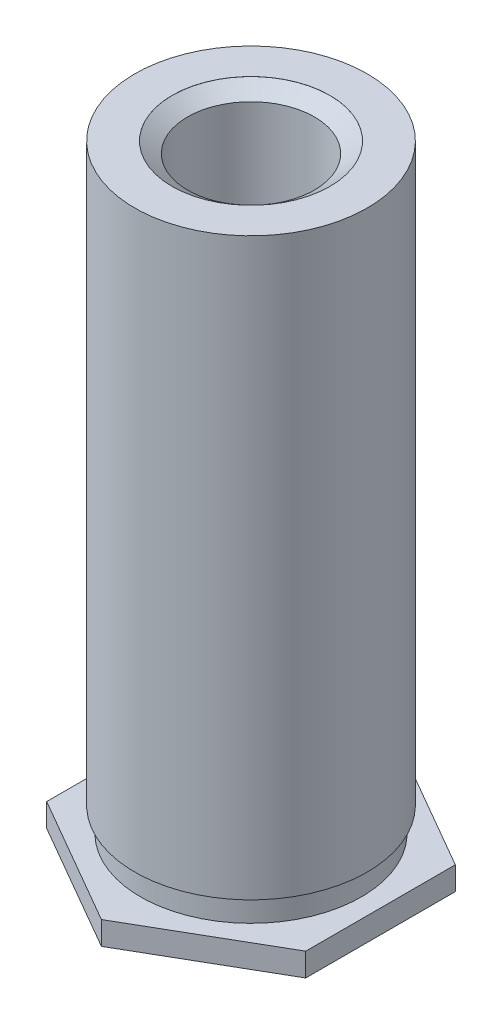
ISO-10303-21;
HEADER;
FILE_DESCRIPTION(('STEP AP214'),'2;1');
FILE_NAME('part.step','',(''),(''),'','','');
FILE_SCHEMA(('AUTOMOTIVE_DESIGN { 1 0 10303 214 1 1 1 1 }'));
ENDSEC;
DATA;
#1=APPLICATION_CONTEXT('core data for automotive mechanical design processes');
#2=APPLICATION_PROTOCOL_DEFINITION('international standard','automotive_design',2000,#1);
#3=PRODUCT_CONTEXT('',#1,'mechanical');
#4=PRODUCT('Part','Part','',(#3));
#5=PRODUCT_RELATED_PRODUCT_CATEGORY('part','',(#4));
#6=PRODUCT_DEFINITION_FORMATION('','',#4);
#7=PRODUCT_DEFINITION_CONTEXT('part definition',#1,'design');
#8=PRODUCT_DEFINITION('design','',#6,#7);
#9=PRODUCT_DEFINITION_SHAPE('','',#8);
#10=(LENGTH_UNIT() NAMED_UNIT(*) SI_UNIT(.MILLI.,.METRE.));
#11=(NAMED_UNIT(*) PLANE_ANGLE_UNIT() SI_UNIT($,.RADIAN.));
#12=(NAMED_UNIT(*) SI_UNIT($,.STERADIAN.) SOLID_ANGLE_UNIT());
#13=UNCERTAINTY_MEASURE_WITH_UNIT(LENGTH_MEASURE(1.E-05),#10,'distance_accuracy_value','');
#14=(GEOMETRIC_REPRESENTATION_CONTEXT(3) GLOBAL_UNCERTAINTY_ASSIGNED_CONTEXT((#13)) GLOBAL_UNIT_ASSIGNED_CONTEXT((#10,
#11,#12)) REPRESENTATION_CONTEXT('',''));
#15=CARTESIAN_POINT('',(0.,0.,0.));
#16=DIRECTION('',(0.,0.,1.));
#17=DIRECTION('',(1.,0.,0.));
#18=AXIS2_PLACEMENT_3D('',#15,#16,#17);
#19=CARTESIAN_POINT('',(4.596384,0.7112,0.));
#20=DIRECTION('',(0.,1.,0.));
#21=DIRECTION('',(0.,0.,1.));
#22=AXIS2_PLACEMENT_3D('',#19,#20,#21);
#23=PLANE('',#22);
#24=CARTESIAN_POINT('',(0.,0.711199999999999,0.));
#25=DIRECTION('',(0.,-1.,0.));
#26=DIRECTION('',(0.,0.,-1.));
#27=AXIS2_PLACEMENT_3D('',#24,#25,#26);
#28=CIRCLE('',#27,3.3782);
#29=CARTESIAN_POINT('',(0.,0.711199999999999,-3.3782));
#30=VERTEX_POINT('',#29);
#31=EDGE_CURVE('E11',#30,#30,#28,.T.);
#32=ORIENTED_EDGE('',*,*,#31,.T.);
#33=EDGE_LOOP('',(#32));
#34=FACE_BOUND('',#33,.T.);
#35=DIRECTION('',(0.866025403784439,0.,0.5));
#36=VECTOR('',#35,1.);
#37=CARTESIAN_POINT('',(0.,0.7112,4.57538541327395));
#38=LINE('',#37,#36);
#39=CARTESIAN_POINT('',(-3.9624,0.7112,2.28769270663697));
#40=VERTEX_POINT('',#39);
#41=CARTESIAN_POINT('',(0.,0.7112,4.57538541327395));
#42=VERTEX_POINT('',#41);
#43=EDGE_CURVE('E130',#40,#42,#38,.T.);
#44=ORIENTED_EDGE('',*,*,#43,.T.);
#45=DIRECTION('',(0.866025403784439,0.,-0.5));
#46=VECTOR('',#45,1.);
#47=CARTESIAN_POINT('',(3.9624,0.7112,2.28769270663697));
#48=LINE('',#47,#46);
#49=CARTESIAN_POINT('',(3.9624,0.7112,2.28769270663697));
#50=VERTEX_POINT('',#49);
#51=EDGE_CURVE('E119',#42,#50,#48,.T.);
#52=ORIENTED_EDGE('',*,*,#51,.T.);
#53=DIRECTION('',(0.,0.,-1.));
#54=VECTOR('',#53,1.);
#55=CARTESIAN_POINT('',(3.9624,0.7112,-2.28769270663697));
#56=LINE('',#55,#54);
#57=CARTESIAN_POINT('',(3.9624,0.7112,-2.28769270663697));
#58=VERTEX_POINT('',#57);
#59=EDGE_CURVE('E122',#50,#58,#56,.T.);
#60=ORIENTED_EDGE('',*,*,#59,.T.);
#61=DIRECTION('',(-0.866025403784439,0.,-0.5));
#62=VECTOR('',#61,1.);
#63=CARTESIAN_POINT('',(0.,0.7112,-4.57538541327395));
#64=LINE('',#63,#62);
#65=CARTESIAN_POINT('',(0.,0.7112,-4.57538541327395));
#66=VERTEX_POINT('',#65);
#67=EDGE_CURVE('E47',#58,#66,#64,.T.);
#68=ORIENTED_EDGE('',*,*,#67,.T.);
#69=DIRECTION('',(-0.866025403784439,0.,0.5));
#70=VECTOR('',#69,1.);
#71=CARTESIAN_POINT('',(-3.9624,0.7112,-2.28769270663697));
#72=LINE('',#71,#70);
#73=CARTESIAN_POINT('',(-3.9624,0.7112,-2.28769270663697));
#74=VERTEX_POINT('',#73);
#75=EDGE_CURVE('E95',#66,#74,#72,.T.);
#76=ORIENTED_EDGE('',*,*,#75,.T.);
#77=DIRECTION('',(0.,0.,1.));
#78=VECTOR('',#77,1.);
#79=CARTESIAN_POINT('',(-3.9624,0.7112,2.28769270663697));
#80=LINE('',#79,#78);
#81=EDGE_CURVE('E127',#74,#40,#80,.T.);
#82=ORIENTED_EDGE('',*,*,#81,.T.);
#83=EDGE_LOOP('',(#44,#52,#60,#68,#76,#82));
#84=FACE_BOUND('',#83,.T.);
#85=ADVANCED_FACE('F32',(#34,#84),#23,.T.);
#86=CARTESIAN_POINT('',(0.,0.,0.));
#87=DIRECTION('',(0.,-1.,0.));
#88=DIRECTION('',(0.,0.,-1.));
#89=AXIS2_PLACEMENT_3D('',#86,#87,#88);
#90=CYLINDRICAL_SURFACE('',#89,3.3782);
#91=CARTESIAN_POINT('',(0.,1.45796,0.));
#92=DIRECTION('',(0.,-1.,0.));
#93=DIRECTION('',(0.,0.,-1.));
#94=AXIS2_PLACEMENT_3D('',#91,#92,#93);
#95=CIRCLE('',#94,3.3782);
#96=CARTESIAN_POINT('',(0.,1.45796,-3.3782));
#97=VERTEX_POINT('',#96);
#98=EDGE_CURVE('E40',#97,#97,#95,.T.);
#99=ORIENTED_EDGE('',*,*,#98,.T.);
#100=EDGE_LOOP('',(#99));
#101=FACE_BOUND('',#100,.T.);
#102=ORIENTED_EDGE('',*,*,#31,.F.);
#103=EDGE_LOOP('',(#102));
#104=FACE_BOUND('',#103,.T.);
#105=ADVANCED_FACE('F164',(#101,#104),#90,.T.);
#106=CARTESIAN_POINT('',(3.556,1.45796,0.));
#107=DIRECTION('',(0.,-1.,0.));
#108=DIRECTION('',(0.,0.,-1.));
#109=AXIS2_PLACEMENT_3D('',#106,#107,#108);
#110=PLANE('',#109);
#111=CARTESIAN_POINT('',(0.,1.45796,0.));
#112=DIRECTION('',(0.,-1.,0.));
#113=DIRECTION('',(0.,0.,-1.));
#114=AXIS2_PLACEMENT_3D('',#111,#112,#113);
#115=CIRCLE('',#114,3.556);
#116=CARTESIAN_POINT('',(0.,1.45796,-3.556));
#117=VERTEX_POINT('',#116);
#118=EDGE_CURVE('E158',#117,#117,#115,.T.);
#119=ORIENTED_EDGE('',*,*,#118,.T.);
#120=EDGE_LOOP('',(#119));
#121=FACE_BOUND('',#120,.T.);
#122=ORIENTED_EDGE('',*,*,#98,.F.);
#123=EDGE_LOOP('',(#122));
#124=FACE_BOUND('',#123,.T.);
#125=ADVANCED_FACE('F167',(#121,#124),#110,.T.);
#126=CARTESIAN_POINT('',(0.,0.,0.));
#127=DIRECTION('',(0.,-1.,0.));
#128=DIRECTION('',(0.,0.,-1.));
#129=AXIS2_PLACEMENT_3D('',#126,#127,#128);
#130=CYLINDRICAL_SURFACE('',#129,3.556);
#131=CARTESIAN_POINT('',(0.,19.05,0.));
#132=DIRECTION('',(0.,-1.,0.));
#133=DIRECTION('',(0.,0.,-1.));
#134=AXIS2_PLACEMENT_3D('',#131,#132,#133);
#135=CIRCLE('',#134,3.556);
#136=CARTESIAN_POINT('',(0.,19.05,-3.556));
#137=VERTEX_POINT('',#136);
#138=EDGE_CURVE('E155',#137,#137,#135,.T.);
#139=ORIENTED_EDGE('',*,*,#138,.T.);
#140=EDGE_LOOP('',(#139));
#141=FACE_BOUND('',#140,.T.);
#142=ORIENTED_EDGE('',*,*,#118,.F.);
#143=EDGE_LOOP('',(#142));
#144=FACE_BOUND('',#143,.T.);
#145=ADVANCED_FACE('F169',(#141,#144),#130,.T.);
#146=CARTESIAN_POINT('',(3.556,19.05,0.));
#147=DIRECTION('',(0.,1.,0.));
#148=DIRECTION('',(0.,0.,1.));
#149=AXIS2_PLACEMENT_3D('',#146,#147,#148);
#150=PLANE('',#149);
#151=CARTESIAN_POINT('',(0.,19.05,0.));
#152=DIRECTION('',(0.,1.,0.));
#153=DIRECTION('',(0.,0.,1.));
#154=AXIS2_PLACEMENT_3D('',#151,#152,#153);
#155=CIRCLE('',#154,2.413);
#156=CARTESIAN_POINT('',(0.,19.05,2.413));
#157=VERTEX_POINT('',#156);
#158=EDGE_CURVE('E35',#157,#157,#155,.T.);
#159=ORIENTED_EDGE('',*,*,#158,.F.);
#160=EDGE_LOOP('',(#159));
#161=FACE_BOUND('',#160,.T.);
#162=ORIENTED_EDGE('',*,*,#138,.F.);
#163=EDGE_LOOP('',(#162));
#164=FACE_BOUND('',#163,.T.);
#165=ADVANCED_FACE('F176',(#161,#164),#150,.T.);
#166=CARTESIAN_POINT('',(0.,-2.54,0.));
#167=DIRECTION('',(0.,-1.,0.));
#168=DIRECTION('',(0.,0.,-1.));
#169=AXIS2_PLACEMENT_3D('',#166,#167,#168);
#170=CYLINDRICAL_SURFACE('',#169,2.413);
#171=ORIENTED_EDGE('',*,*,#158,.T.);
#172=EDGE_LOOP('',(#171));
#173=FACE_BOUND('',#172,.T.);
#174=CARTESIAN_POINT('',(0.,19.04746,0.));
#175=DIRECTION('',(0.,-1.,0.));
#176=DIRECTION('',(0.,0.,-1.));
#177=AXIS2_PLACEMENT_3D('',#174,#175,#176);
#178=CIRCLE('',#177,2.413);
#179=CARTESIAN_POINT('',(0.,19.04746,-2.413));
#180=VERTEX_POINT('',#179);
#181=EDGE_CURVE('E135',#180,#180,#178,.T.);
#182=ORIENTED_EDGE('',*,*,#181,.T.);
#183=EDGE_LOOP('',(#182));
#184=FACE_BOUND('',#183,.T.);
#185=ADVANCED_FACE('F215',(#173,#184),#170,.F.);
#186=CARTESIAN_POINT('',(0.,18.7167768195347,0.));
#187=DIRECTION('',(0.,1.,0.));
#188=DIRECTION('',(0.,0.,1.));
#189=AXIS2_PLACEMENT_3D('',#186,#187,#188);
#190=CONICAL_SURFACE('',#189,1.94056,0.960105621522079);
#191=ORIENTED_EDGE('',*,*,#181,.F.);
#192=EDGE_LOOP('',(#191));
#193=FACE_BOUND('',#192,.T.);
#194=CARTESIAN_POINT('',(0.,18.7167768195347,0.));
#195=DIRECTION('',(0.,-1.,0.));
#196=DIRECTION('',(0.,0.,-1.));
#197=AXIS2_PLACEMENT_3D('',#194,#195,#196);
#198=CIRCLE('',#197,1.94056);
#199=CARTESIAN_POINT('',(0.,18.7167768195347,-1.94056));
#200=VERTEX_POINT('',#199);
#201=EDGE_CURVE('E143',#200,#200,#198,.T.);
#202=ORIENTED_EDGE('',*,*,#201,.T.);
#203=EDGE_LOOP('',(#202));
#204=FACE_BOUND('',#203,.T.);
#205=ADVANCED_FACE('F211',(#193,#204),#190,.F.);
#206=CARTESIAN_POINT('',(0.,4.75879372940127,0.));
#207=DIRECTION('',(0.,1.,0.));
#208=DIRECTION('',(0.,0.,1.));
#209=AXIS2_PLACEMENT_3D('',#206,#207,#208);
#210=CONICAL_SURFACE('',#209,0.,1.17809724509617);
#211=CARTESIAN_POINT('',(0.,5.5626,0.));
#212=DIRECTION('',(0.,-1.,0.));
#213=DIRECTION('',(0.,0.,-1.));
#214=AXIS2_PLACEMENT_3D('',#211,#212,#213);
#215=CIRCLE('',#214,1.94056);
#216=CARTESIAN_POINT('',(0.,5.5626,-1.94056));
#217=VERTEX_POINT('',#216);
#218=EDGE_CURVE('E146',#217,#217,#215,.T.);
#219=ORIENTED_EDGE('',*,*,#218,.F.);
#220=EDGE_LOOP('',(#219));
#221=FACE_BOUND('',#220,.T.);
#222=CARTESIAN_POINT('',(0.,4.75879372940127,0.));
#223=VERTEX_POINT('',#222);
#224=VERTEX_LOOP('',#223);
#225=FACE_BOUND('',#224,.T.);
#226=ADVANCED_FACE('F214',(#221,#225),#210,.F.);
#227=CARTESIAN_POINT('',(0.,0.,0.));
#228=DIRECTION('',(0.,-1.,0.));
#229=DIRECTION('',(0.,0.,-1.));
#230=AXIS2_PLACEMENT_3D('',#227,#228,#229);
#231=CYLINDRICAL_SURFACE('',#230,1.94056);
#232=ORIENTED_EDGE('',*,*,#201,.F.);
#233=EDGE_LOOP('',(#232));
#234=FACE_BOUND('',#233,.T.);
#235=ORIENTED_EDGE('',*,*,#218,.T.);
#236=EDGE_LOOP('',(#235));
#237=FACE_BOUND('',#236,.T.);
#238=ADVANCED_FACE('F210',(#234,#237),#231,.F.);
#239=CARTESIAN_POINT('',(3.9624,0.,2.28769270663697));
#240=DIRECTION('',(0.5,0.,0.866025403784439));
#241=DIRECTION('',(0.866025403784439,0.,-0.5));
#242=AXIS2_PLACEMENT_3D('',#239,#240,#241);
#243=PLANE('',#242);
#244=ORIENTED_EDGE('',*,*,#51,.F.);
#245=DIRECTION('',(0.,1.,0.));
#246=VECTOR('',#245,1.);
#247=CARTESIAN_POINT('',(0.,0.,4.57538541327395));
#248=LINE('',#247,#246);
#249=CARTESIAN_POINT('',(0.,0.,4.57538541327395));
#250=VERTEX_POINT('',#249);
#251=EDGE_CURVE('E133',#250,#42,#248,.T.);
#252=ORIENTED_EDGE('',*,*,#251,.F.);
#253=DIRECTION('',(0.866025403784439,0.,-0.5));
#254=VECTOR('',#253,1.);
#255=CARTESIAN_POINT('',(3.9624,0.,2.28769270663697));
#256=LINE('',#255,#254);
#257=CARTESIAN_POINT('',(3.9624,0.,2.28769270663697));
#258=VERTEX_POINT('',#257);
#259=EDGE_CURVE('E55',#250,#258,#256,.T.);
#260=ORIENTED_EDGE('',*,*,#259,.T.);
#261=DIRECTION('',(0.,1.,0.));
#262=VECTOR('',#261,1.);
#263=CARTESIAN_POINT('',(3.9624,0.,2.28769270663697));
#264=LINE('',#263,#262);
#265=EDGE_CURVE('E118',#258,#50,#264,.T.);
#266=ORIENTED_EDGE('',*,*,#265,.T.);
#267=EDGE_LOOP('',(#244,#252,#260,#266));
#268=FACE_BOUND('',#267,.T.);
#269=ADVANCED_FACE('F190',(#268),#243,.T.);
#270=CARTESIAN_POINT('',(0.,0.,4.57538541327395));
#271=DIRECTION('',(-0.5,0.,0.866025403784439));
#272=DIRECTION('',(0.866025403784439,0.,0.5));
#273=AXIS2_PLACEMENT_3D('',#270,#271,#272);
#274=PLANE('',#273);
#275=ORIENTED_EDGE('',*,*,#43,.F.);
#276=DIRECTION('',(0.,1.,0.));
#277=VECTOR('',#276,1.);
#278=CARTESIAN_POINT('',(-3.9624,0.,2.28769270663697));
#279=LINE('',#278,#277);
#280=CARTESIAN_POINT('',(-3.9624,0.,2.28769270663697));
#281=VERTEX_POINT('',#280);
#282=EDGE_CURVE('E136',#281,#40,#279,.T.);
#283=ORIENTED_EDGE('',*,*,#282,.F.);
#284=DIRECTION('',(0.866025403784439,0.,0.5));
#285=VECTOR('',#284,1.);
#286=CARTESIAN_POINT('',(0.,0.,4.57538541327395));
#287=LINE('',#286,#285);
#288=EDGE_CURVE('E112',#281,#250,#287,.T.);
#289=ORIENTED_EDGE('',*,*,#288,.T.);
#290=ORIENTED_EDGE('',*,*,#251,.T.);
#291=EDGE_LOOP('',(#275,#283,#289,#290));
#292=FACE_BOUND('',#291,.T.);
#293=ADVANCED_FACE('F189',(#292),#274,.T.);
#294=CARTESIAN_POINT('',(-3.9624,0.,2.28769270663697));
#295=DIRECTION('',(-1.,0.,0.));
#296=DIRECTION('',(0.,0.,1.));
#297=AXIS2_PLACEMENT_3D('',#294,#295,#296);
#298=PLANE('',#297);
#299=ORIENTED_EDGE('',*,*,#81,.F.);
#300=DIRECTION('',(0.,1.,0.));
#301=VECTOR('',#300,1.);
#302=CARTESIAN_POINT('',(-3.9624,0.,-2.28769270663697));
#303=LINE('',#302,#301);
#304=CARTESIAN_POINT('',(-3.9624,0.,-2.28769270663697));
#305=VERTEX_POINT('',#304);
#306=EDGE_CURVE('E96',#305,#74,#303,.T.);
#307=ORIENTED_EDGE('',*,*,#306,.F.);
#308=DIRECTION('',(0.,0.,1.));
#309=VECTOR('',#308,1.);
#310=CARTESIAN_POINT('',(-3.9624,0.,2.28769270663697));
#311=LINE('',#310,#309);
#312=EDGE_CURVE('E110',#305,#281,#311,.T.);
#313=ORIENTED_EDGE('',*,*,#312,.T.);
#314=ORIENTED_EDGE('',*,*,#282,.T.);
#315=EDGE_LOOP('',(#299,#307,#313,#314));
#316=FACE_BOUND('',#315,.T.);
#317=ADVANCED_FACE('F278',(#316),#298,.T.);
#318=CARTESIAN_POINT('',(-3.9624,0.,-2.28769270663697));
#319=DIRECTION('',(-0.5,0.,-0.866025403784439));
#320=DIRECTION('',(-0.866025403784439,0.,0.5));
#321=AXIS2_PLACEMENT_3D('',#318,#319,#320);
#322=PLANE('',#321);
#323=ORIENTED_EDGE('',*,*,#75,.F.);
#324=DIRECTION('',(0.,1.,0.));
#325=VECTOR('',#324,1.);
#326=CARTESIAN_POINT('',(0.,0.,-4.57538541327395));
#327=LINE('',#326,#325);
#328=CARTESIAN_POINT('',(0.,0.,-4.57538541327395));
#329=VERTEX_POINT('',#328);
#330=EDGE_CURVE('E88',#329,#66,#327,.T.);
#331=ORIENTED_EDGE('',*,*,#330,.F.);
#332=DIRECTION('',(-0.866025403784439,0.,0.5));
#333=VECTOR('',#332,1.);
#334=CARTESIAN_POINT('',(-3.9624,0.,-2.28769270663697));
#335=LINE('',#334,#333);
#336=EDGE_CURVE('E92',#329,#305,#335,.T.);
#337=ORIENTED_EDGE('',*,*,#336,.T.);
#338=ORIENTED_EDGE('',*,*,#306,.T.);
#339=EDGE_LOOP('',(#323,#331,#337,#338));
#340=FACE_BOUND('',#339,.T.);
#341=ADVANCED_FACE('F90',(#340),#322,.T.);
#342=CARTESIAN_POINT('',(0.,0.,-4.57538541327395));
#343=DIRECTION('',(0.5,0.,-0.866025403784439));
#344=DIRECTION('',(-0.866025403784439,0.,-0.5));
#345=AXIS2_PLACEMENT_3D('',#342,#343,#344);
#346=PLANE('',#345);
#347=ORIENTED_EDGE('',*,*,#67,.F.);
#348=DIRECTION('',(0.,1.,0.));
#349=VECTOR('',#348,1.);
#350=CARTESIAN_POINT('',(3.9624,0.,-2.28769270663697));
#351=LINE('',#350,#349);
#352=CARTESIAN_POINT('',(3.9624,0.,-2.28769270663697));
#353=VERTEX_POINT('',#352);
#354=EDGE_CURVE('E97',#353,#58,#351,.T.);
#355=ORIENTED_EDGE('',*,*,#354,.F.);
#356=DIRECTION('',(-0.866025403784439,0.,-0.5));
#357=VECTOR('',#356,1.);
#358=CARTESIAN_POINT('',(0.,0.,-4.57538541327395));
#359=LINE('',#358,#357);
#360=EDGE_CURVE('E100',#353,#329,#359,.T.);
#361=ORIENTED_EDGE('',*,*,#360,.T.);
#362=ORIENTED_EDGE('',*,*,#330,.T.);
#363=EDGE_LOOP('',(#347,#355,#361,#362));
#364=FACE_BOUND('',#363,.T.);
#365=ADVANCED_FACE('F101',(#364),#346,.T.);
#366=CARTESIAN_POINT('',(3.9624,0.,-2.28769270663697));
#367=DIRECTION('',(1.,0.,0.));
#368=DIRECTION('',(0.,0.,-1.));
#369=AXIS2_PLACEMENT_3D('',#366,#367,#368);
#370=PLANE('',#369);
#371=ORIENTED_EDGE('',*,*,#59,.F.);
#372=ORIENTED_EDGE('',*,*,#265,.F.);
#373=DIRECTION('',(0.,0.,-1.));
#374=VECTOR('',#373,1.);
#375=CARTESIAN_POINT('',(3.9624,0.,-2.28769270663697));
#376=LINE('',#375,#374);
#377=EDGE_CURVE('E105',#258,#353,#376,.T.);
#378=ORIENTED_EDGE('',*,*,#377,.T.);
#379=ORIENTED_EDGE('',*,*,#354,.T.);
#380=EDGE_LOOP('',(#371,#372,#378,#379));
#381=FACE_BOUND('',#380,.T.);
#382=ADVANCED_FACE('F193',(#381),#370,.T.);
#383=CARTESIAN_POINT('',(3.556,0.00253999999999977,0.));
#384=DIRECTION('',(0.,-1.,0.));
#385=DIRECTION('',(0.,0.,-1.));
#386=AXIS2_PLACEMENT_3D('',#383,#384,#385);
#387=PLANE('',#386);
#388=CARTESIAN_POINT('',(0.,0.00253999999999999,0.));
#389=DIRECTION('',(0.,-1.,0.));
#390=DIRECTION('',(0.,0.,-1.));
#391=AXIS2_PLACEMENT_3D('',#388,#389,#390);
#392=CIRCLE('',#391,3.556);
#393=CARTESIAN_POINT('',(0.,0.00253999999999999,-3.556));
#394=VERTEX_POINT('',#393);
#395=EDGE_CURVE('E152',#394,#394,#392,.T.);
#396=ORIENTED_EDGE('',*,*,#395,.T.);
#397=EDGE_LOOP('',(#396));
#398=FACE_BOUND('',#397,.T.);
#399=ADVANCED_FACE('F196',(#398),#387,.T.);
#400=CARTESIAN_POINT('',(0.,0.,0.));
#401=DIRECTION('',(0.,-1.,0.));
#402=DIRECTION('',(0.,0.,-1.));
#403=AXIS2_PLACEMENT_3D('',#400,#401,#402);
#404=CYLINDRICAL_SURFACE('',#403,3.556);
#405=CARTESIAN_POINT('',(0.,0.,0.));
#406=DIRECTION('',(0.,-1.,0.));
#407=DIRECTION('',(0.,0.,-1.));
#408=AXIS2_PLACEMENT_3D('',#405,#406,#407);
#409=CIRCLE('',#408,3.556);
#410=CARTESIAN_POINT('',(0.,0.,-3.556));
#411=VERTEX_POINT('',#410);
#412=EDGE_CURVE('E149',#411,#411,#409,.T.);
#413=ORIENTED_EDGE('',*,*,#412,.T.);
#414=EDGE_LOOP('',(#413));
#415=FACE_BOUND('',#414,.T.);
#416=ORIENTED_EDGE('',*,*,#395,.F.);
#417=EDGE_LOOP('',(#416));
#418=FACE_BOUND('',#417,.T.);
#419=ADVANCED_FACE('F202',(#415,#418),#404,.F.);
#420=CARTESIAN_POINT('',(3.556,0.,0.));
#421=DIRECTION('',(0.,-1.,0.));
#422=DIRECTION('',(0.,0.,-1.));
#423=AXIS2_PLACEMENT_3D('',#420,#421,#422);
#424=PLANE('',#423);
#425=ORIENTED_EDGE('',*,*,#412,.F.);
#426=EDGE_LOOP('',(#425));
#427=FACE_BOUND('',#426,.T.);
#428=ORIENTED_EDGE('',*,*,#377,.F.);
#429=ORIENTED_EDGE('',*,*,#259,.F.);
#430=ORIENTED_EDGE('',*,*,#288,.F.);
#431=ORIENTED_EDGE('',*,*,#312,.F.);
#432=ORIENTED_EDGE('',*,*,#336,.F.);
#433=ORIENTED_EDGE('',*,*,#360,.F.);
#434=EDGE_LOOP('',(#428,#429,#430,#431,#432,#433));
#435=FACE_BOUND('',#434,.T.);
#436=ADVANCED_FACE('F107',(#427,#435),#424,.T.);
#437=CLOSED_SHELL('',(#85,#105,#125,#145,#165,#185,#205,#226,#238,#269,#293,#317,#341,#365,#382,
#399,#419,#436));
#438=MANIFOLD_SOLID_BREP('B2',#437);
#439=ADVANCED_BREP_SHAPE_REPRESENTATION('',(#18,#438),#14);
#440=SHAPE_DEFINITION_REPRESENTATION(#9,#439);
ENDSEC;
END-ISO-10303-21;
